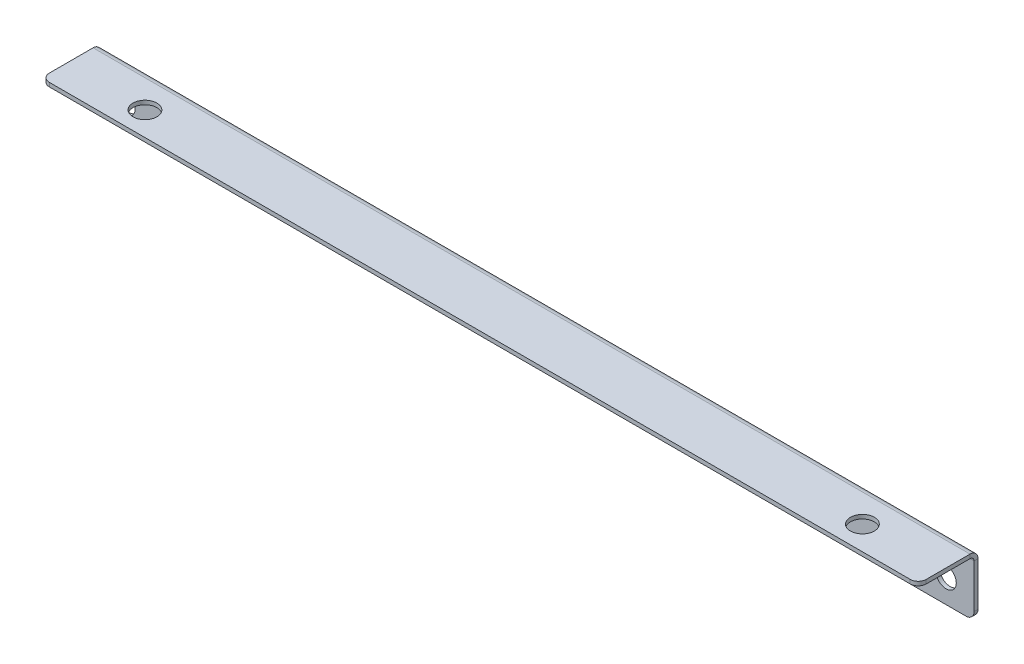
ISO-10303-21;
HEADER;
FILE_DESCRIPTION(('STEP AP214'),'2;1');
FILE_NAME('part.step','',(''),(''),'','','');
FILE_SCHEMA(('AUTOMOTIVE_DESIGN { 1 0 10303 214 1 1 1 1 }'));
ENDSEC;
DATA;
#1=APPLICATION_CONTEXT('core data for automotive mechanical design processes');
#2=APPLICATION_PROTOCOL_DEFINITION('international standard','automotive_design',2000,#1);
#3=PRODUCT_CONTEXT('',#1,'mechanical');
#4=PRODUCT('Part','Part','',(#3));
#5=PRODUCT_RELATED_PRODUCT_CATEGORY('part','',(#4));
#6=PRODUCT_DEFINITION_FORMATION('','',#4);
#7=PRODUCT_DEFINITION_CONTEXT('part definition',#1,'design');
#8=PRODUCT_DEFINITION('design','',#6,#7);
#9=PRODUCT_DEFINITION_SHAPE('','',#8);
#10=(LENGTH_UNIT() NAMED_UNIT(*) SI_UNIT(.MILLI.,.METRE.));
#11=(NAMED_UNIT(*) PLANE_ANGLE_UNIT() SI_UNIT($,.RADIAN.));
#12=(NAMED_UNIT(*) SI_UNIT($,.STERADIAN.) SOLID_ANGLE_UNIT());
#13=UNCERTAINTY_MEASURE_WITH_UNIT(LENGTH_MEASURE(1.E-05),#10,'distance_accuracy_value','');
#14=(GEOMETRIC_REPRESENTATION_CONTEXT(3) GLOBAL_UNCERTAINTY_ASSIGNED_CONTEXT((#13)) GLOBAL_UNIT_ASSIGNED_CONTEXT((#10,
#11,#12)) REPRESENTATION_CONTEXT('',''));
#15=CARTESIAN_POINT('',(0.,0.,0.));
#16=DIRECTION('',(0.,0.,1.));
#17=DIRECTION('',(1.,0.,0.));
#18=AXIS2_PLACEMENT_3D('',#15,#16,#17);
#19=CARTESIAN_POINT('',(0.,14.0000000000001,15.));
#20=DIRECTION('',(0.,0.,-1.));
#21=DIRECTION('',(1.,0.,0.));
#22=AXIS2_PLACEMENT_3D('',#19,#20,#21);
#23=PLANE('',#22);
#24=DIRECTION('',(1.,0.,0.));
#25=VECTOR('',#24,1.);
#26=CARTESIAN_POINT('',(0.,14.0000000000001,15.));
#27=LINE('',#26,#25);
#28=CARTESIAN_POINT('',(218.,14.0000000000001,15.));
#29=VERTEX_POINT('',#28);
#30=CARTESIAN_POINT('',(2.,14.0000000000001,15.));
#31=VERTEX_POINT('',#30);
#32=EDGE_CURVE('E132',#29,#31,#27,.F.);
#33=ORIENTED_EDGE('',*,*,#32,.F.);
#34=DIRECTION('',(0.,1.,0.));
#35=VECTOR('',#34,1.);
#36=CARTESIAN_POINT('',(218.,14.0000000000001,15.));
#37=LINE('',#36,#35);
#38=CARTESIAN_POINT('',(218.,15.0000000000001,15.));
#39=VERTEX_POINT('',#38);
#40=EDGE_CURVE('E245',#29,#39,#37,.T.);
#41=ORIENTED_EDGE('',*,*,#40,.T.);
#42=DIRECTION('',(1.,0.,0.));
#43=VECTOR('',#42,1.);
#44=CARTESIAN_POINT('',(0.,15.0000000000001,15.));
#45=LINE('',#44,#43);
#46=CARTESIAN_POINT('',(2.,15.0000000000001,15.));
#47=VERTEX_POINT('',#46);
#48=EDGE_CURVE('E203',#39,#47,#45,.F.);
#49=ORIENTED_EDGE('',*,*,#48,.T.);
#50=DIRECTION('',(0.,-1.,0.));
#51=VECTOR('',#50,1.);
#52=CARTESIAN_POINT('',(2.,14.0000000000001,15.));
#53=LINE('',#52,#51);
#54=EDGE_CURVE('E242',#47,#31,#53,.T.);
#55=ORIENTED_EDGE('',*,*,#54,.T.);
#56=EDGE_LOOP('',(#33,#41,#49,#55));
#57=FACE_BOUND('',#56,.T.);
#58=ADVANCED_FACE('F36',(#57),#23,.F.);
#59=CARTESIAN_POINT('',(0.,14.,0.));
#60=DIRECTION('',(-1.,0.,0.));
#61=DIRECTION('',(0.,0.,-1.));
#62=AXIS2_PLACEMENT_3D('',#59,#60,#61);
#63=PLANE('',#62);
#64=DIRECTION('',(0.,0.,-1.));
#65=VECTOR('',#64,1.);
#66=CARTESIAN_POINT('',(0.,14.,0.));
#67=LINE('',#66,#65);
#68=CARTESIAN_POINT('',(0.,14.,13.));
#69=VERTEX_POINT('',#68);
#70=CARTESIAN_POINT('',(0.,14.,2.));
#71=VERTEX_POINT('',#70);
#72=EDGE_CURVE('E124',#69,#71,#67,.T.);
#73=ORIENTED_EDGE('',*,*,#72,.F.);
#74=DIRECTION('',(0.,1.,0.));
#75=VECTOR('',#74,1.);
#76=CARTESIAN_POINT('',(0.,14.,13.));
#77=LINE('',#76,#75);
#78=CARTESIAN_POINT('',(0.,15.,13.));
#79=VERTEX_POINT('',#78);
#80=EDGE_CURVE('E11',#69,#79,#77,.T.);
#81=ORIENTED_EDGE('',*,*,#80,.T.);
#82=DIRECTION('',(0.,0.,-1.));
#83=VECTOR('',#82,1.);
#84=CARTESIAN_POINT('',(0.,15.,0.));
#85=LINE('',#84,#83);
#86=CARTESIAN_POINT('',(0.,15.,1.99999999999999));
#87=VERTEX_POINT('',#86);
#88=EDGE_CURVE('E138',#79,#87,#85,.T.);
#89=ORIENTED_EDGE('',*,*,#88,.T.);
#90=DIRECTION('',(0.,-1.,0.));
#91=VECTOR('',#90,1.);
#92=CARTESIAN_POINT('',(0.,14.,2.));
#93=LINE('',#92,#91);
#94=EDGE_CURVE('E135',#87,#71,#93,.T.);
#95=ORIENTED_EDGE('',*,*,#94,.T.);
#96=EDGE_LOOP('',(#73,#81,#89,#95));
#97=FACE_BOUND('',#96,.T.);
#98=ADVANCED_FACE('F137',(#97),#63,.T.);
#99=CARTESIAN_POINT('',(0.,13.,2.));
#100=DIRECTION('',(1.,0.,0.));
#101=DIRECTION('',(0.,0.,-1.));
#102=AXIS2_PLACEMENT_3D('',#99,#100,#101);
#103=PLANE('',#102);
#104=ORIENTED_EDGE('',*,*,#94,.F.);
#105=CARTESIAN_POINT('',(0.,13.,2.));
#106=DIRECTION('',(-1.,0.,0.));
#107=DIRECTION('',(0.,0.,1.));
#108=AXIS2_PLACEMENT_3D('',#105,#106,#107);
#109=CIRCLE('',#108,2.);
#110=CARTESIAN_POINT('',(0.,13.,0.));
#111=VERTEX_POINT('',#110);
#112=EDGE_CURVE('E191',#87,#111,#109,.T.);
#113=ORIENTED_EDGE('',*,*,#112,.T.);
#114=DIRECTION('',(0.,0.,1.));
#115=VECTOR('',#114,1.);
#116=CARTESIAN_POINT('',(0.,13.,1.));
#117=LINE('',#116,#115);
#118=CARTESIAN_POINT('',(0.,13.,1.));
#119=VERTEX_POINT('',#118);
#120=EDGE_CURVE('E143',#111,#119,#117,.T.);
#121=ORIENTED_EDGE('',*,*,#120,.T.);
#122=CARTESIAN_POINT('',(0.,13.,2.));
#123=DIRECTION('',(-1.,0.,0.));
#124=DIRECTION('',(0.,0.,1.));
#125=AXIS2_PLACEMENT_3D('',#122,#123,#124);
#126=CIRCLE('',#125,1.);
#127=EDGE_CURVE('E147',#71,#119,#126,.T.);
#128=ORIENTED_EDGE('',*,*,#127,.F.);
#129=EDGE_LOOP('',(#104,#113,#121,#128));
#130=FACE_BOUND('',#129,.T.);
#131=ADVANCED_FACE('F148',(#130),#103,.F.);
#132=CARTESIAN_POINT('',(0.,0.,1.));
#133=DIRECTION('',(-1.,0.,0.));
#134=DIRECTION('',(0.,1.,0.));
#135=AXIS2_PLACEMENT_3D('',#132,#133,#134);
#136=PLANE('',#135);
#137=DIRECTION('',(0.,1.,0.));
#138=VECTOR('',#137,1.);
#139=CARTESIAN_POINT('',(0.,0.,0.));
#140=LINE('',#139,#138);
#141=CARTESIAN_POINT('',(0.,2.,0.));
#142=VERTEX_POINT('',#141);
#143=EDGE_CURVE('E197',#142,#111,#140,.T.);
#144=ORIENTED_EDGE('',*,*,#143,.F.);
#145=DIRECTION('',(0.,0.,1.));
#146=VECTOR('',#145,1.);
#147=CARTESIAN_POINT('',(0.,2.,1.));
#148=LINE('',#147,#146);
#149=CARTESIAN_POINT('',(0.,2.,1.));
#150=VERTEX_POINT('',#149);
#151=EDGE_CURVE('E44',#142,#150,#148,.T.);
#152=ORIENTED_EDGE('',*,*,#151,.T.);
#153=DIRECTION('',(0.,1.,0.));
#154=VECTOR('',#153,1.);
#155=CARTESIAN_POINT('',(0.,0.,1.));
#156=LINE('',#155,#154);
#157=EDGE_CURVE('E169',#150,#119,#156,.T.);
#158=ORIENTED_EDGE('',*,*,#157,.T.);
#159=ORIENTED_EDGE('',*,*,#120,.F.);
#160=EDGE_LOOP('',(#144,#152,#158,#159));
#161=FACE_BOUND('',#160,.T.);
#162=ADVANCED_FACE('F254',(#161),#136,.T.);
#163=CARTESIAN_POINT('',(0.,0.,1.));
#164=DIRECTION('',(0.,-1.,0.));
#165=DIRECTION('',(-1.,0.,0.));
#166=AXIS2_PLACEMENT_3D('',#163,#164,#165);
#167=PLANE('',#166);
#168=DIRECTION('',(-1.,0.,0.));
#169=VECTOR('',#168,1.);
#170=CARTESIAN_POINT('',(0.,0.,0.));
#171=LINE('',#170,#169);
#172=CARTESIAN_POINT('',(218.,0.,0.));
#173=VERTEX_POINT('',#172);
#174=CARTESIAN_POINT('',(2.,0.,0.));
#175=VERTEX_POINT('',#174);
#176=EDGE_CURVE('E194',#173,#175,#171,.T.);
#177=ORIENTED_EDGE('',*,*,#176,.F.);
#178=DIRECTION('',(0.,0.,-1.));
#179=VECTOR('',#178,1.);
#180=CARTESIAN_POINT('',(218.,0.,1.));
#181=LINE('',#180,#179);
#182=CARTESIAN_POINT('',(218.,0.,1.));
#183=VERTEX_POINT('',#182);
#184=EDGE_CURVE('E223',#173,#183,#181,.F.);
#185=ORIENTED_EDGE('',*,*,#184,.T.);
#186=DIRECTION('',(-1.,0.,0.));
#187=VECTOR('',#186,1.);
#188=CARTESIAN_POINT('',(0.,0.,1.));
#189=LINE('',#188,#187);
#190=CARTESIAN_POINT('',(2.,0.,1.));
#191=VERTEX_POINT('',#190);
#192=EDGE_CURVE('E171',#183,#191,#189,.T.);
#193=ORIENTED_EDGE('',*,*,#192,.T.);
#194=DIRECTION('',(0.,0.,1.));
#195=VECTOR('',#194,1.);
#196=CARTESIAN_POINT('',(2.,0.,1.));
#197=LINE('',#196,#195);
#198=EDGE_CURVE('E142',#191,#175,#197,.F.);
#199=ORIENTED_EDGE('',*,*,#198,.T.);
#200=EDGE_LOOP('',(#177,#185,#193,#199));
#201=FACE_BOUND('',#200,.T.);
#202=ADVANCED_FACE('F346',(#201),#167,.T.);
#203=CARTESIAN_POINT('',(220.,0.,1.));
#204=DIRECTION('',(-1.,0.,0.));
#205=DIRECTION('',(0.,1.,0.));
#206=AXIS2_PLACEMENT_3D('',#203,#204,#205);
#207=PLANE('',#206);
#208=DIRECTION('',(0.,1.,0.));
#209=VECTOR('',#208,1.);
#210=CARTESIAN_POINT('',(220.,0.,1.));
#211=LINE('',#210,#209);
#212=CARTESIAN_POINT('',(220.,13.,1.));
#213=VERTEX_POINT('',#212);
#214=CARTESIAN_POINT('',(220.,2.,1.));
#215=VERTEX_POINT('',#214);
#216=EDGE_CURVE('E174',#213,#215,#211,.F.);
#217=ORIENTED_EDGE('',*,*,#216,.T.);
#218=DIRECTION('',(0.,0.,1.));
#219=VECTOR('',#218,1.);
#220=CARTESIAN_POINT('',(220.,2.,1.));
#221=LINE('',#220,#219);
#222=CARTESIAN_POINT('',(220.,2.,0.));
#223=VERTEX_POINT('',#222);
#224=EDGE_CURVE('E230',#215,#223,#221,.F.);
#225=ORIENTED_EDGE('',*,*,#224,.T.);
#226=DIRECTION('',(0.,1.,0.));
#227=VECTOR('',#226,1.);
#228=CARTESIAN_POINT('',(220.,0.,0.));
#229=LINE('',#228,#227);
#230=CARTESIAN_POINT('',(220.,13.,0.));
#231=VERTEX_POINT('',#230);
#232=EDGE_CURVE('E188',#231,#223,#229,.F.);
#233=ORIENTED_EDGE('',*,*,#232,.F.);
#234=DIRECTION('',(0.,0.,1.));
#235=VECTOR('',#234,1.);
#236=CARTESIAN_POINT('',(220.,13.,1.));
#237=LINE('',#236,#235);
#238=EDGE_CURVE('E218',#231,#213,#237,.T.);
#239=ORIENTED_EDGE('',*,*,#238,.T.);
#240=EDGE_LOOP('',(#217,#225,#233,#239));
#241=FACE_BOUND('',#240,.T.);
#242=ADVANCED_FACE('F484',(#241),#207,.F.);
#243=CARTESIAN_POINT('',(220.,13.,2.));
#244=DIRECTION('',(1.,0.,0.));
#245=DIRECTION('',(0.,0.,-1.));
#246=AXIS2_PLACEMENT_3D('',#243,#244,#245);
#247=PLANE('',#246);
#248=ORIENTED_EDGE('',*,*,#238,.F.);
#249=CARTESIAN_POINT('',(220.,13.,2.));
#250=DIRECTION('',(-1.,0.,0.));
#251=DIRECTION('',(0.,0.,1.));
#252=AXIS2_PLACEMENT_3D('',#249,#250,#251);
#253=CIRCLE('',#252,2.);
#254=CARTESIAN_POINT('',(220.,15.,1.99999999999999));
#255=VERTEX_POINT('',#254);
#256=EDGE_CURVE('E187',#255,#231,#253,.T.);
#257=ORIENTED_EDGE('',*,*,#256,.F.);
#258=DIRECTION('',(0.,-1.,0.));
#259=VECTOR('',#258,1.);
#260=CARTESIAN_POINT('',(220.,14.,1.99999999999999));
#261=LINE('',#260,#259);
#262=CARTESIAN_POINT('',(220.,14.,1.99999999999999));
#263=VERTEX_POINT('',#262);
#264=EDGE_CURVE('E153',#255,#263,#261,.T.);
#265=ORIENTED_EDGE('',*,*,#264,.T.);
#266=CARTESIAN_POINT('',(220.,13.,2.));
#267=DIRECTION('',(-1.,0.,0.));
#268=DIRECTION('',(0.,0.,1.));
#269=AXIS2_PLACEMENT_3D('',#266,#267,#268);
#270=CIRCLE('',#269,1.);
#271=EDGE_CURVE('E154',#263,#213,#270,.T.);
#272=ORIENTED_EDGE('',*,*,#271,.T.);
#273=EDGE_LOOP('',(#248,#257,#265,#272));
#274=FACE_BOUND('',#273,.T.);
#275=ADVANCED_FACE('F264',(#274),#247,.T.);
#276=CARTESIAN_POINT('',(20.,14.,9.));
#277=DIRECTION('',(0.,1.,0.));
#278=DIRECTION('',(0.,0.,1.));
#279=AXIS2_PLACEMENT_3D('',#276,#277,#278);
#280=CYLINDRICAL_SURFACE('',#279,3.);
#281=CARTESIAN_POINT('',(20.,14.,9.));
#282=DIRECTION('',(0.,1.,0.));
#283=DIRECTION('',(0.,0.,1.));
#284=AXIS2_PLACEMENT_3D('',#281,#282,#283);
#285=CIRCLE('',#284,3.);
#286=CARTESIAN_POINT('',(20.,14.,12.));
#287=VERTEX_POINT('',#286);
#288=EDGE_CURVE('E201',#287,#287,#285,.T.);
#289=ORIENTED_EDGE('',*,*,#288,.F.);
#290=EDGE_LOOP('',(#289));
#291=FACE_BOUND('',#290,.T.);
#292=CARTESIAN_POINT('',(20.,15.,9.));
#293=DIRECTION('',(0.,1.,0.));
#294=DIRECTION('',(0.,0.,1.));
#295=AXIS2_PLACEMENT_3D('',#292,#293,#294);
#296=CIRCLE('',#295,3.);
#297=CARTESIAN_POINT('',(20.,15.,12.));
#298=VERTEX_POINT('',#297);
#299=EDGE_CURVE('E213',#298,#298,#296,.T.);
#300=ORIENTED_EDGE('',*,*,#299,.T.);
#301=EDGE_LOOP('',(#300));
#302=FACE_BOUND('',#301,.T.);
#303=ADVANCED_FACE('F292',(#291,#302),#280,.F.);
#304=CARTESIAN_POINT('',(200.,14.,9.));
#305=DIRECTION('',(0.,1.,0.));
#306=DIRECTION('',(0.,0.,1.));
#307=AXIS2_PLACEMENT_3D('',#304,#305,#306);
#308=CYLINDRICAL_SURFACE('',#307,2.99999999999999);
#309=CARTESIAN_POINT('',(200.,14.,9.));
#310=DIRECTION('',(0.,1.,0.));
#311=DIRECTION('',(0.,0.,1.));
#312=AXIS2_PLACEMENT_3D('',#309,#310,#311);
#313=CIRCLE('',#312,2.99999999999999);
#314=CARTESIAN_POINT('',(200.,14.,12.));
#315=VERTEX_POINT('',#314);
#316=EDGE_CURVE('E282',#315,#315,#313,.T.);
#317=ORIENTED_EDGE('',*,*,#316,.F.);
#318=EDGE_LOOP('',(#317));
#319=FACE_BOUND('',#318,.T.);
#320=CARTESIAN_POINT('',(200.,15.,9.));
#321=DIRECTION('',(0.,1.,0.));
#322=DIRECTION('',(0.,0.,1.));
#323=AXIS2_PLACEMENT_3D('',#320,#321,#322);
#324=CIRCLE('',#323,2.99999999999999);
#325=CARTESIAN_POINT('',(200.,15.,12.));
#326=VERTEX_POINT('',#325);
#327=EDGE_CURVE('E208',#326,#326,#324,.T.);
#328=ORIENTED_EDGE('',*,*,#327,.T.);
#329=EDGE_LOOP('',(#328));
#330=FACE_BOUND('',#329,.T.);
#331=ADVANCED_FACE('F295',(#319,#330),#308,.F.);
#332=CARTESIAN_POINT('',(7.,6.,1.));
#333=DIRECTION('',(0.,0.,1.));
#334=DIRECTION('',(1.,0.,0.));
#335=AXIS2_PLACEMENT_3D('',#332,#333,#334);
#336=CYLINDRICAL_SURFACE('',#335,2.55);
#337=CARTESIAN_POINT('',(7.,6.,1.));
#338=DIRECTION('',(0.,0.,1.));
#339=DIRECTION('',(1.,0.,0.));
#340=AXIS2_PLACEMENT_3D('',#337,#338,#339);
#341=CIRCLE('',#340,2.55);
#342=CARTESIAN_POINT('',(9.55,6.,1.));
#343=VERTEX_POINT('',#342);
#344=EDGE_CURVE('E160',#343,#343,#341,.T.);
#345=ORIENTED_EDGE('',*,*,#344,.T.);
#346=EDGE_LOOP('',(#345));
#347=FACE_BOUND('',#346,.T.);
#348=CARTESIAN_POINT('',(7.,6.,0.));
#349=DIRECTION('',(0.,0.,1.));
#350=DIRECTION('',(1.,0.,0.));
#351=AXIS2_PLACEMENT_3D('',#348,#349,#350);
#352=CIRCLE('',#351,2.55);
#353=CARTESIAN_POINT('',(9.55,6.,0.));
#354=VERTEX_POINT('',#353);
#355=EDGE_CURVE('E183',#354,#354,#352,.T.);
#356=ORIENTED_EDGE('',*,*,#355,.F.);
#357=EDGE_LOOP('',(#356));
#358=FACE_BOUND('',#357,.T.);
#359=ADVANCED_FACE('F307',(#347,#358),#336,.F.);
#360=CARTESIAN_POINT('',(213.,6.,1.));
#361=DIRECTION('',(0.,0.,1.));
#362=DIRECTION('',(1.,0.,0.));
#363=AXIS2_PLACEMENT_3D('',#360,#361,#362);
#364=CYLINDRICAL_SURFACE('',#363,2.55);
#365=CARTESIAN_POINT('',(213.,6.,1.));
#366=DIRECTION('',(0.,0.,1.));
#367=DIRECTION('',(1.,0.,0.));
#368=AXIS2_PLACEMENT_3D('',#365,#366,#367);
#369=CIRCLE('',#368,2.55);
#370=CARTESIAN_POINT('',(215.55,6.,1.));
#371=VERTEX_POINT('',#370);
#372=EDGE_CURVE('E163',#371,#371,#369,.T.);
#373=ORIENTED_EDGE('',*,*,#372,.T.);
#374=EDGE_LOOP('',(#373));
#375=FACE_BOUND('',#374,.T.);
#376=CARTESIAN_POINT('',(213.,6.,0.));
#377=DIRECTION('',(0.,0.,1.));
#378=DIRECTION('',(1.,0.,0.));
#379=AXIS2_PLACEMENT_3D('',#376,#377,#378);
#380=CIRCLE('',#379,2.55);
#381=CARTESIAN_POINT('',(215.55,6.,0.));
#382=VERTEX_POINT('',#381);
#383=EDGE_CURVE('E199',#382,#382,#380,.T.);
#384=ORIENTED_EDGE('',*,*,#383,.F.);
#385=EDGE_LOOP('',(#384));
#386=FACE_BOUND('',#385,.T.);
#387=ADVANCED_FACE('F313',(#375,#386),#364,.F.);
#388=CARTESIAN_POINT('',(220.,14.,0.));
#389=DIRECTION('',(-1.,0.,0.));
#390=DIRECTION('',(0.,0.,-1.));
#391=AXIS2_PLACEMENT_3D('',#388,#389,#390);
#392=PLANE('',#391);
#393=DIRECTION('',(0.,0.,-1.));
#394=VECTOR('',#393,1.);
#395=CARTESIAN_POINT('',(220.,15.,0.));
#396=LINE('',#395,#394);
#397=CARTESIAN_POINT('',(220.,15.,13.));
#398=VERTEX_POINT('',#397);
#399=EDGE_CURVE('E205',#255,#398,#396,.F.);
#400=ORIENTED_EDGE('',*,*,#399,.T.);
#401=DIRECTION('',(0.,1.,0.));
#402=VECTOR('',#401,1.);
#403=CARTESIAN_POINT('',(220.,14.,13.));
#404=LINE('',#403,#402);
#405=CARTESIAN_POINT('',(220.,14.,13.));
#406=VERTEX_POINT('',#405);
#407=EDGE_CURVE('E236',#398,#406,#404,.F.);
#408=ORIENTED_EDGE('',*,*,#407,.T.);
#409=DIRECTION('',(0.,0.,-1.));
#410=VECTOR('',#409,1.);
#411=CARTESIAN_POINT('',(220.,14.,0.));
#412=LINE('',#411,#410);
#413=EDGE_CURVE('E270',#263,#406,#412,.F.);
#414=ORIENTED_EDGE('',*,*,#413,.F.);
#415=ORIENTED_EDGE('',*,*,#264,.F.);
#416=EDGE_LOOP('',(#400,#408,#414,#415));
#417=FACE_BOUND('',#416,.T.);
#418=ADVANCED_FACE('F267',(#417),#392,.F.);
#419=CARTESIAN_POINT('',(0.,13.,2.));
#420=DIRECTION('',(-1.,0.,0.));
#421=DIRECTION('',(0.,0.,1.));
#422=AXIS2_PLACEMENT_3D('',#419,#420,#421);
#423=CYLINDRICAL_SURFACE('',#422,1.);
#424=ORIENTED_EDGE('',*,*,#271,.F.);
#425=DIRECTION('',(-1.,0.,0.));
#426=VECTOR('',#425,1.);
#427=CARTESIAN_POINT('',(0.,14.,2.));
#428=LINE('',#427,#426);
#429=EDGE_CURVE('E129',#71,#263,#428,.F.);
#430=ORIENTED_EDGE('',*,*,#429,.F.);
#431=ORIENTED_EDGE('',*,*,#127,.T.);
#432=DIRECTION('',(-1.,0.,0.));
#433=VECTOR('',#432,1.);
#434=CARTESIAN_POINT('',(0.,13.,1.));
#435=LINE('',#434,#433);
#436=EDGE_CURVE('E177',#119,#213,#435,.F.);
#437=ORIENTED_EDGE('',*,*,#436,.T.);
#438=EDGE_LOOP('',(#424,#430,#431,#437));
#439=FACE_BOUND('',#438,.T.);
#440=ADVANCED_FACE('F157',(#439),#423,.F.);
#441=CARTESIAN_POINT('',(0.,0.,1.));
#442=DIRECTION('',(0.,0.,-1.));
#443=DIRECTION('',(-1.,0.,0.));
#444=AXIS2_PLACEMENT_3D('',#441,#442,#443);
#445=PLANE('',#444);
#446=ORIENTED_EDGE('',*,*,#344,.F.);
#447=EDGE_LOOP('',(#446));
#448=FACE_BOUND('',#447,.T.);
#449=ORIENTED_EDGE('',*,*,#372,.F.);
#450=EDGE_LOOP('',(#449));
#451=FACE_BOUND('',#450,.T.);
#452=ORIENTED_EDGE('',*,*,#192,.F.);
#453=CARTESIAN_POINT('',(218.,2.,1.));
#454=DIRECTION('',(0.,0.,-1.));
#455=DIRECTION('',(-1.,0.,0.));
#456=AXIS2_PLACEMENT_3D('',#453,#454,#455);
#457=CIRCLE('',#456,2.);
#458=EDGE_CURVE('E228',#183,#215,#457,.F.);
#459=ORIENTED_EDGE('',*,*,#458,.T.);
#460=ORIENTED_EDGE('',*,*,#216,.F.);
#461=ORIENTED_EDGE('',*,*,#436,.F.);
#462=ORIENTED_EDGE('',*,*,#157,.F.);
#463=CARTESIAN_POINT('',(2.,2.,1.));
#464=DIRECTION('',(0.,0.,-1.));
#465=DIRECTION('',(-1.,0.,0.));
#466=AXIS2_PLACEMENT_3D('',#463,#464,#465);
#467=CIRCLE('',#466,2.);
#468=EDGE_CURVE('E226',#150,#191,#467,.F.);
#469=ORIENTED_EDGE('',*,*,#468,.T.);
#470=EDGE_LOOP('',(#452,#459,#460,#461,#462,#469));
#471=FACE_BOUND('',#470,.T.);
#472=ADVANCED_FACE('F259',(#448,#451,#471),#445,.F.);
#473=CARTESIAN_POINT('',(0.,14.,0.));
#474=DIRECTION('',(0.,-1.,0.));
#475=DIRECTION('',(0.,0.,-1.));
#476=AXIS2_PLACEMENT_3D('',#473,#474,#475);
#477=PLANE('',#476);
#478=ORIENTED_EDGE('',*,*,#288,.T.);
#479=EDGE_LOOP('',(#478));
#480=FACE_BOUND('',#479,.T.);
#481=ORIENTED_EDGE('',*,*,#316,.T.);
#482=EDGE_LOOP('',(#481));
#483=FACE_BOUND('',#482,.T.);
#484=ORIENTED_EDGE('',*,*,#413,.T.);
#485=CARTESIAN_POINT('',(218.,14.,13.));
#486=DIRECTION('',(0.,-1.,0.));
#487=DIRECTION('',(0.,0.,-1.));
#488=AXIS2_PLACEMENT_3D('',#485,#486,#487);
#489=CIRCLE('',#488,2.);
#490=EDGE_CURVE('E240',#406,#29,#489,.T.);
#491=ORIENTED_EDGE('',*,*,#490,.T.);
#492=ORIENTED_EDGE('',*,*,#32,.T.);
#493=CARTESIAN_POINT('',(2.,14.,13.));
#494=DIRECTION('',(0.,-1.,0.));
#495=DIRECTION('',(0.,0.,-1.));
#496=AXIS2_PLACEMENT_3D('',#493,#494,#495);
#497=CIRCLE('',#496,2.);
#498=EDGE_CURVE('E131',#31,#69,#497,.T.);
#499=ORIENTED_EDGE('',*,*,#498,.T.);
#500=ORIENTED_EDGE('',*,*,#72,.T.);
#501=ORIENTED_EDGE('',*,*,#429,.T.);
#502=EDGE_LOOP('',(#484,#491,#492,#499,#500,#501));
#503=FACE_BOUND('',#502,.T.);
#504=ADVANCED_FACE('F127',(#480,#483,#503),#477,.T.);
#505=CARTESIAN_POINT('',(0.,13.,2.));
#506=DIRECTION('',(-1.,0.,0.));
#507=DIRECTION('',(0.,0.,1.));
#508=AXIS2_PLACEMENT_3D('',#505,#506,#507);
#509=CYLINDRICAL_SURFACE('',#508,2.);
#510=ORIENTED_EDGE('',*,*,#256,.T.);
#511=DIRECTION('',(-1.,0.,0.));
#512=VECTOR('',#511,1.);
#513=CARTESIAN_POINT('',(0.,13.,0.));
#514=LINE('',#513,#512);
#515=EDGE_CURVE('E184',#111,#231,#514,.F.);
#516=ORIENTED_EDGE('',*,*,#515,.F.);
#517=ORIENTED_EDGE('',*,*,#112,.F.);
#518=DIRECTION('',(1.,0.,0.));
#519=VECTOR('',#518,1.);
#520=CARTESIAN_POINT('',(0.,15.,1.99999999999999));
#521=LINE('',#520,#519);
#522=EDGE_CURVE('E180',#87,#255,#521,.T.);
#523=ORIENTED_EDGE('',*,*,#522,.T.);
#524=EDGE_LOOP('',(#510,#516,#517,#523));
#525=FACE_BOUND('',#524,.T.);
#526=ADVANCED_FACE('F273',(#525),#509,.T.);
#527=CARTESIAN_POINT('',(0.,0.,0.));
#528=DIRECTION('',(0.,0.,-1.));
#529=DIRECTION('',(-1.,0.,0.));
#530=AXIS2_PLACEMENT_3D('',#527,#528,#529);
#531=PLANE('',#530);
#532=ORIENTED_EDGE('',*,*,#355,.T.);
#533=EDGE_LOOP('',(#532));
#534=FACE_BOUND('',#533,.T.);
#535=ORIENTED_EDGE('',*,*,#383,.T.);
#536=EDGE_LOOP('',(#535));
#537=FACE_BOUND('',#536,.T.);
#538=ORIENTED_EDGE('',*,*,#232,.T.);
#539=CARTESIAN_POINT('',(218.,2.,0.));
#540=DIRECTION('',(0.,0.,-1.));
#541=DIRECTION('',(-1.,0.,0.));
#542=AXIS2_PLACEMENT_3D('',#539,#540,#541);
#543=CIRCLE('',#542,2.);
#544=EDGE_CURVE('E234',#223,#173,#543,.T.);
#545=ORIENTED_EDGE('',*,*,#544,.T.);
#546=ORIENTED_EDGE('',*,*,#176,.T.);
#547=CARTESIAN_POINT('',(2.,2.,0.));
#548=DIRECTION('',(0.,0.,-1.));
#549=DIRECTION('',(-1.,0.,0.));
#550=AXIS2_PLACEMENT_3D('',#547,#548,#549);
#551=CIRCLE('',#550,2.);
#552=EDGE_CURVE('E232',#175,#142,#551,.T.);
#553=ORIENTED_EDGE('',*,*,#552,.T.);
#554=ORIENTED_EDGE('',*,*,#143,.T.);
#555=ORIENTED_EDGE('',*,*,#515,.T.);
#556=EDGE_LOOP('',(#538,#545,#546,#553,#554,#555));
#557=FACE_BOUND('',#556,.T.);
#558=ADVANCED_FACE('F302',(#534,#537,#557),#531,.T.);
#559=CARTESIAN_POINT('',(0.,15.,0.));
#560=DIRECTION('',(0.,-1.,0.));
#561=DIRECTION('',(0.,0.,-1.));
#562=AXIS2_PLACEMENT_3D('',#559,#560,#561);
#563=PLANE('',#562);
#564=ORIENTED_EDGE('',*,*,#299,.F.);
#565=EDGE_LOOP('',(#564));
#566=FACE_BOUND('',#565,.T.);
#567=ORIENTED_EDGE('',*,*,#327,.F.);
#568=EDGE_LOOP('',(#567));
#569=FACE_BOUND('',#568,.T.);
#570=ORIENTED_EDGE('',*,*,#48,.F.);
#571=CARTESIAN_POINT('',(218.,15.,13.));
#572=DIRECTION('',(0.,-1.,0.));
#573=DIRECTION('',(0.,0.,-1.));
#574=AXIS2_PLACEMENT_3D('',#571,#572,#573);
#575=CIRCLE('',#574,2.);
#576=EDGE_CURVE('E248',#39,#398,#575,.F.);
#577=ORIENTED_EDGE('',*,*,#576,.T.);
#578=ORIENTED_EDGE('',*,*,#399,.F.);
#579=ORIENTED_EDGE('',*,*,#522,.F.);
#580=ORIENTED_EDGE('',*,*,#88,.F.);
#581=CARTESIAN_POINT('',(2.,15.,13.));
#582=DIRECTION('',(0.,-1.,0.));
#583=DIRECTION('',(0.,0.,-1.));
#584=AXIS2_PLACEMENT_3D('',#581,#582,#583);
#585=CIRCLE('',#584,2.);
#586=EDGE_CURVE('E56',#79,#47,#585,.F.);
#587=ORIENTED_EDGE('',*,*,#586,.T.);
#588=EDGE_LOOP('',(#570,#577,#578,#579,#580,#587));
#589=FACE_BOUND('',#588,.T.);
#590=ADVANCED_FACE('F276',(#566,#569,#589),#563,.F.);
#591=CARTESIAN_POINT('',(218.,2.,1.));
#592=DIRECTION('',(0.,0.,-1.));
#593=DIRECTION('',(-1.,0.,0.));
#594=AXIS2_PLACEMENT_3D('',#591,#592,#593);
#595=CYLINDRICAL_SURFACE('',#594,2.);
#596=ORIENTED_EDGE('',*,*,#544,.F.);
#597=ORIENTED_EDGE('',*,*,#224,.F.);
#598=ORIENTED_EDGE('',*,*,#458,.F.);
#599=ORIENTED_EDGE('',*,*,#184,.F.);
#600=EDGE_LOOP('',(#596,#597,#598,#599));
#601=FACE_BOUND('',#600,.T.);
#602=ADVANCED_FACE('F301',(#601),#595,.T.);
#603=CARTESIAN_POINT('',(218.,14.,13.));
#604=DIRECTION('',(0.,-1.,0.));
#605=DIRECTION('',(0.,0.,-1.));
#606=AXIS2_PLACEMENT_3D('',#603,#604,#605);
#607=CYLINDRICAL_SURFACE('',#606,2.);
#608=ORIENTED_EDGE('',*,*,#576,.F.);
#609=ORIENTED_EDGE('',*,*,#40,.F.);
#610=ORIENTED_EDGE('',*,*,#490,.F.);
#611=ORIENTED_EDGE('',*,*,#407,.F.);
#612=EDGE_LOOP('',(#608,#609,#610,#611));
#613=FACE_BOUND('',#612,.T.);
#614=ADVANCED_FACE('F280',(#613),#607,.T.);
#615=CARTESIAN_POINT('',(2.,2.,1.));
#616=DIRECTION('',(0.,0.,1.));
#617=DIRECTION('',(1.,0.,0.));
#618=AXIS2_PLACEMENT_3D('',#615,#616,#617);
#619=CYLINDRICAL_SURFACE('',#618,2.);
#620=ORIENTED_EDGE('',*,*,#552,.F.);
#621=ORIENTED_EDGE('',*,*,#198,.F.);
#622=ORIENTED_EDGE('',*,*,#468,.F.);
#623=ORIENTED_EDGE('',*,*,#151,.F.);
#624=EDGE_LOOP('',(#620,#621,#622,#623));
#625=FACE_BOUND('',#624,.T.);
#626=ADVANCED_FACE('F348',(#625),#619,.T.);
#627=CARTESIAN_POINT('',(2.,14.,13.));
#628=DIRECTION('',(0.,1.,0.));
#629=DIRECTION('',(0.,0.,1.));
#630=AXIS2_PLACEMENT_3D('',#627,#628,#629);
#631=CYLINDRICAL_SURFACE('',#630,2.);
#632=ORIENTED_EDGE('',*,*,#586,.F.);
#633=ORIENTED_EDGE('',*,*,#80,.F.);
#634=ORIENTED_EDGE('',*,*,#498,.F.);
#635=ORIENTED_EDGE('',*,*,#54,.F.);
#636=EDGE_LOOP('',(#632,#633,#634,#635));
#637=FACE_BOUND('',#636,.T.);
#638=ADVANCED_FACE('F38',(#637),#631,.T.);
#639=CLOSED_SHELL('',(#58,#98,#131,#162,#202,#242,#275,#303,#331,#359,#387,#418,#440,#472,#504,
#526,#558,#590,#602,#614,#626,#638));
#640=MANIFOLD_SOLID_BREP('B2',#639);
#641=ADVANCED_BREP_SHAPE_REPRESENTATION('',(#18,#640),#14);
#642=SHAPE_DEFINITION_REPRESENTATION(#9,#641);
ENDSEC;
END-ISO-10303-21;
